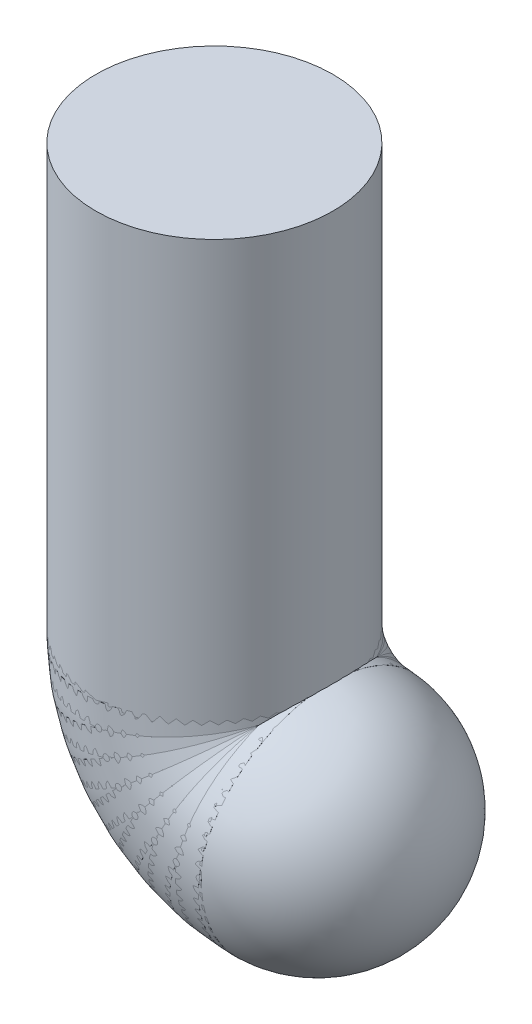
ISO-10303-21;
HEADER;
FILE_DESCRIPTION(('STEP AP214'),'2;1');
FILE_NAME('part.step','',(''),(''),'','','');
FILE_SCHEMA(('AUTOMOTIVE_DESIGN { 1 0 10303 214 1 1 1 1 }'));
ENDSEC;
DATA;
#1=APPLICATION_CONTEXT('core data for automotive mechanical design processes');
#2=APPLICATION_PROTOCOL_DEFINITION('international standard','automotive_design',2000,#1);
#3=PRODUCT_CONTEXT('',#1,'mechanical');
#4=PRODUCT('Part','Part','',(#3));
#5=PRODUCT_RELATED_PRODUCT_CATEGORY('part','',(#4));
#6=PRODUCT_DEFINITION_FORMATION('','',#4);
#7=PRODUCT_DEFINITION_CONTEXT('part definition',#1,'design');
#8=PRODUCT_DEFINITION('design','',#6,#7);
#9=PRODUCT_DEFINITION_SHAPE('','',#8);
#10=(LENGTH_UNIT() NAMED_UNIT(*) SI_UNIT(.MILLI.,.METRE.));
#11=(NAMED_UNIT(*) PLANE_ANGLE_UNIT() SI_UNIT($,.RADIAN.));
#12=(NAMED_UNIT(*) SI_UNIT($,.STERADIAN.) SOLID_ANGLE_UNIT());
#13=UNCERTAINTY_MEASURE_WITH_UNIT(LENGTH_MEASURE(1.E-05),#10,'distance_accuracy_value','');
#14=(GEOMETRIC_REPRESENTATION_CONTEXT(3) GLOBAL_UNCERTAINTY_ASSIGNED_CONTEXT((#13)) GLOBAL_UNIT_ASSIGNED_CONTEXT((#10,
#11,#12)) REPRESENTATION_CONTEXT('',''));
#15=CARTESIAN_POINT('',(0.,0.,0.));
#16=DIRECTION('',(0.,0.,1.));
#17=DIRECTION('',(1.,0.,0.));
#18=AXIS2_PLACEMENT_3D('',#15,#16,#17);
#19=CARTESIAN_POINT('',(-26.,-77.5,196.));
#20=DIRECTION('',(0.,-1.,0.));
#21=DIRECTION('',(0.,0.,-1.));
#22=AXIS2_PLACEMENT_3D('',#19,#20,#21);
#23=PLANE('',#22);
#24=CARTESIAN_POINT('',(-26.,-77.5,196.));
#25=DIRECTION('',(0.,-1.,0.));
#26=DIRECTION('',(0.,0.,-1.));
#27=AXIS2_PLACEMENT_3D('',#24,#25,#26);
#28=CIRCLE('',#27,4.5);
#29=CARTESIAN_POINT('',(-26.,-77.5,191.5));
#30=VERTEX_POINT('',#29);
#31=EDGE_CURVE('P0_E10',#30,#30,#28,.T.);
#32=ORIENTED_EDGE('',*,*,#31,.F.);
#33=EDGE_LOOP('',(#32));
#34=FACE_BOUND('',#33,.T.);
#35=ADVANCED_FACE('P0_F15',(#34),#23,.F.);
#36=CARTESIAN_POINT('',(-26.,-93.58,196.));
#37=DIRECTION('',(0.,-1.,0.));
#38=DIRECTION('',(0.,0.,-1.));
#39=AXIS2_PLACEMENT_3D('',#36,#37,#38);
#40=PLANE('',#39);
#41=CARTESIAN_POINT('',(-26.,-93.58,196.));
#42=DIRECTION('',(0.,-1.,0.));
#43=DIRECTION('',(0.,0.,-1.));
#44=AXIS2_PLACEMENT_3D('',#41,#42,#43);
#45=CIRCLE('',#44,4.5);
#46=CARTESIAN_POINT('',(-26.,-93.58,191.5));
#47=VERTEX_POINT('',#46);
#48=EDGE_CURVE('P0_E40',#47,#47,#45,.T.);
#49=ORIENTED_EDGE('',*,*,#48,.T.);
#50=EDGE_LOOP('',(#49));
#51=FACE_BOUND('',#50,.T.);
#52=ADVANCED_FACE('P0_F43',(#51),#40,.T.);
#53=CARTESIAN_POINT('',(-26.,-77.5,196.));
#54=DIRECTION('',(0.,-1.,0.));
#55=DIRECTION('',(0.,0.,-1.));
#56=AXIS2_PLACEMENT_3D('',#53,#54,#55);
#57=CYLINDRICAL_SURFACE('',#56,4.5);
#58=ORIENTED_EDGE('',*,*,#48,.F.);
#59=DIRECTION('',(0.,-1.,0.));
#60=VECTOR('',#59,1.);
#61=CARTESIAN_POINT('',(-26.,-77.5,191.5));
#62=LINE('',#61,#60);
#63=EDGE_CURVE('P0_E18',#30,#47,#62,.T.);
#64=ORIENTED_EDGE('',*,*,#63,.F.);
#65=ORIENTED_EDGE('',*,*,#31,.T.);
#66=ORIENTED_EDGE('',*,*,#63,.T.);
#67=EDGE_LOOP('',(#58,#64,#65,#66));
#68=FACE_BOUND('',#67,.T.);
#69=ADVANCED_FACE('P0_F39',(#68),#57,.T.);
#70=CLOSED_SHELL('',(#35,#52,#69));
#71=MANIFOLD_SOLID_BREP('P0_B1',#70);
#72=CARTESIAN_POINT('',(-26.,-93.58,196.));
#73=DIRECTION('',(0.111964476103031,-0.993712209893274,0.));
#74=DIRECTION('',(0.,0.,-1.));
#75=AXIS2_PLACEMENT_3D('',#72,#73,#74);
#76=PLANE('',#75);
#77=CARTESIAN_POINT('',(-26.,-93.58,196.));
#78=DIRECTION('',(0.111964476103031,-0.993712209893274,0.));
#79=DIRECTION('',(-0.993712209893274,-0.111964476103031,0.));
#80=AXIS2_PLACEMENT_3D('',#77,#78,#79);
#81=CIRCLE('',#80,4.5);
#82=CARTESIAN_POINT('',(-30.47170494452,-94.08384014246,196.));
#83=VERTEX_POINT('',#82);
#84=EDGE_CURVE('P1_E11',#83,#83,#81,.T.);
#85=ORIENTED_EDGE('',*,*,#84,.F.);
#86=EDGE_LOOP('',(#85));
#87=FACE_BOUND('',#86,.T.);
#88=ADVANCED_FACE('P1_F16',(#87),#76,.F.);
#89=CARTESIAN_POINT('',(-25.90171741575,-94.4522820611,196.));
#90=DIRECTION('',(0.111964476103031,-0.993712209893274,0.));
#91=DIRECTION('',(0.,0.,-1.));
#92=AXIS2_PLACEMENT_3D('',#89,#90,#91);
#93=PLANE('',#92);
#94=CARTESIAN_POINT('',(-25.90171741575,-94.4522820611,196.));
#95=DIRECTION('',(0.111964476103031,-0.993712209893274,0.));
#96=DIRECTION('',(-0.993712209893274,-0.111964476103031,0.));
#97=AXIS2_PLACEMENT_3D('',#94,#95,#96);
#98=CIRCLE('',#97,4.5);
#99=CARTESIAN_POINT('',(-30.37342236027,-94.95612220357,196.));
#100=VERTEX_POINT('',#99);
#101=EDGE_CURVE('P1_E20',#100,#100,#98,.T.);
#102=ORIENTED_EDGE('',*,*,#101,.T.);
#103=EDGE_LOOP('',(#102));
#104=FACE_BOUND('',#103,.T.);
#105=ADVANCED_FACE('P1_F18',(#104),#93,.T.);
#106=CARTESIAN_POINT('',(-26.,-93.58,196.));
#107=DIRECTION('',(0.111964476103031,-0.993712209893274,0.));
#108=DIRECTION('',(-0.993712209893274,-0.111964476103031,0.));
#109=AXIS2_PLACEMENT_3D('',#106,#107,#108);
#110=CYLINDRICAL_SURFACE('',#109,4.5);
#111=ORIENTED_EDGE('',*,*,#101,.F.);
#112=DIRECTION('',(0.111964476103031,-0.993712209893274,0.));
#113=VECTOR('',#112,1.);
#114=CARTESIAN_POINT('',(-30.47170494452,-94.08384014246,196.));
#115=LINE('',#114,#113);
#116=EDGE_CURVE('P1_E27',#83,#100,#115,.T.);
#117=ORIENTED_EDGE('',*,*,#116,.F.);
#118=ORIENTED_EDGE('',*,*,#84,.T.);
#119=ORIENTED_EDGE('',*,*,#116,.T.);
#120=EDGE_LOOP('',(#111,#117,#118,#119));
#121=FACE_BOUND('',#120,.T.);
#122=ADVANCED_FACE('P1_F41',(#121),#110,.T.);
#123=CLOSED_SHELL('',(#88,#105,#122));
#124=MANIFOLD_SOLID_BREP('P1_B1',#123);
#125=CARTESIAN_POINT('',(-25.90171741575,-94.4522820611,196.));
#126=DIRECTION('',(0.330279061955133,-0.943883330308379,0.));
#127=DIRECTION('',(0.,0.,-1.));
#128=AXIS2_PLACEMENT_3D('',#125,#126,#127);
#129=PLANE('',#128);
#130=CARTESIAN_POINT('',(-25.90171741575,-94.4522820611,196.));
#131=DIRECTION('',(0.330279061955133,-0.94388333030838,0.));
#132=DIRECTION('',(-0.94388333030838,-0.330279061955133,0.));
#133=AXIS2_PLACEMENT_3D('',#130,#131,#132);
#134=CIRCLE('',#133,4.5);
#135=CARTESIAN_POINT('',(-30.14919240214,-95.9385378399,196.));
#136=VERTEX_POINT('',#135);
#137=EDGE_CURVE('P2_E11',#136,#136,#134,.T.);
#138=ORIENTED_EDGE('',*,*,#137,.F.);
#139=EDGE_LOOP('',(#138));
#140=FACE_BOUND('',#139,.T.);
#141=ADVANCED_FACE('P2_F16',(#140),#129,.F.);
#142=CARTESIAN_POINT('',(-25.61179796217,-95.28082425734,196.));
#143=DIRECTION('',(0.330279061955133,-0.943883330308379,0.));
#144=DIRECTION('',(0.,0.,-1.));
#145=AXIS2_PLACEMENT_3D('',#142,#143,#144);
#146=PLANE('',#145);
#147=CARTESIAN_POINT('',(-25.61179796217,-95.28082425734,196.));
#148=DIRECTION('',(0.330279061955133,-0.94388333030838,0.));
#149=DIRECTION('',(-0.94388333030838,-0.330279061955133,0.));
#150=AXIS2_PLACEMENT_3D('',#147,#148,#149);
#151=CIRCLE('',#150,4.5);
#152=CARTESIAN_POINT('',(-29.85927294856,-96.76708003613,196.));
#153=VERTEX_POINT('',#152);
#154=EDGE_CURVE('P2_E20',#153,#153,#151,.T.);
#155=ORIENTED_EDGE('',*,*,#154,.T.);
#156=EDGE_LOOP('',(#155));
#157=FACE_BOUND('',#156,.T.);
#158=ADVANCED_FACE('P2_F44',(#157),#146,.T.);
#159=CARTESIAN_POINT('',(-25.90171741575,-94.4522820611,196.));
#160=DIRECTION('',(0.330279061955133,-0.94388333030838,0.));
#161=DIRECTION('',(-0.94388333030838,-0.330279061955133,0.));
#162=AXIS2_PLACEMENT_3D('',#159,#160,#161);
#163=CYLINDRICAL_SURFACE('',#162,4.5);
#164=ORIENTED_EDGE('',*,*,#154,.F.);
#165=DIRECTION('',(0.330279061955133,-0.943883330308379,0.));
#166=VECTOR('',#165,1.);
#167=CARTESIAN_POINT('',(-30.14919240214,-95.9385378399,196.));
#168=LINE('',#167,#166);
#169=EDGE_CURVE('P2_E27',#136,#153,#168,.T.);
#170=ORIENTED_EDGE('',*,*,#169,.F.);
#171=ORIENTED_EDGE('',*,*,#137,.T.);
#172=ORIENTED_EDGE('',*,*,#169,.T.);
#173=EDGE_LOOP('',(#164,#170,#171,#172));
#174=FACE_BOUND('',#173,.T.);
#175=ADVANCED_FACE('P2_F18',(#174),#163,.T.);
#176=CLOSED_SHELL('',(#141,#158,#175));
#177=MANIFOLD_SOLID_BREP('P2_B1',#176);
#178=CARTESIAN_POINT('',(-25.61179796217,-95.28082425734,196.));
#179=DIRECTION('',(0.532032076515223,-0.846724199228355,0.));
#180=DIRECTION('',(0.,0.,-1.));
#181=AXIS2_PLACEMENT_3D('',#178,#179,#180);
#182=PLANE('',#181);
#183=CARTESIAN_POINT('',(-25.61179796217,-95.28082425734,196.));
#184=DIRECTION('',(0.532032076515223,-0.846724199228355,0.));
#185=DIRECTION('',(-0.846724199228355,-0.532032076515223,0.));
#186=AXIS2_PLACEMENT_3D('',#183,#184,#185);
#187=CIRCLE('',#186,4.5);
#188=CARTESIAN_POINT('',(-29.4220568587,-97.67496860166,196.));
#189=VERTEX_POINT('',#188);
#190=EDGE_CURVE('P3_E11',#189,#189,#187,.T.);
#191=ORIENTED_EDGE('',*,*,#190,.F.);
#192=EDGE_LOOP('',(#191));
#193=FACE_BOUND('',#192,.T.);
#194=ADVANCED_FACE('P3_F16',(#193),#182,.F.);
#195=CARTESIAN_POINT('',(-25.14477941127,-96.02408002328,196.));
#196=DIRECTION('',(0.532032076515223,-0.846724199228355,0.));
#197=DIRECTION('',(0.,0.,-1.));
#198=AXIS2_PLACEMENT_3D('',#195,#196,#197);
#199=PLANE('',#198);
#200=CARTESIAN_POINT('',(-25.14477941127,-96.02408002328,196.));
#201=DIRECTION('',(0.532032076515223,-0.846724199228355,0.));
#202=DIRECTION('',(-0.846724199228355,-0.532032076515223,0.));
#203=AXIS2_PLACEMENT_3D('',#200,#201,#202);
#204=CIRCLE('',#203,4.5);
#205=CARTESIAN_POINT('',(-28.9550383078,-98.4182243676,196.));
#206=VERTEX_POINT('',#205);
#207=EDGE_CURVE('P3_E40',#206,#206,#204,.T.);
#208=ORIENTED_EDGE('',*,*,#207,.T.);
#209=EDGE_LOOP('',(#208));
#210=FACE_BOUND('',#209,.T.);
#211=ADVANCED_FACE('P3_F43',(#210),#199,.T.);
#212=CARTESIAN_POINT('',(-25.61179796217,-95.28082425734,196.));
#213=DIRECTION('',(0.532032076515223,-0.846724199228355,0.));
#214=DIRECTION('',(-0.846724199228355,-0.532032076515223,0.));
#215=AXIS2_PLACEMENT_3D('',#212,#213,#214);
#216=CYLINDRICAL_SURFACE('',#215,4.5);
#217=ORIENTED_EDGE('',*,*,#207,.F.);
#218=DIRECTION('',(0.532032076515223,-0.846724199228355,0.));
#219=VECTOR('',#218,1.);
#220=CARTESIAN_POINT('',(-29.4220568587,-97.67496860166,196.));
#221=LINE('',#220,#219);
#222=EDGE_CURVE('P3_E20',#189,#206,#221,.T.);
#223=ORIENTED_EDGE('',*,*,#222,.F.);
#224=ORIENTED_EDGE('',*,*,#190,.T.);
#225=ORIENTED_EDGE('',*,*,#222,.T.);
#226=EDGE_LOOP('',(#217,#223,#224,#225));
#227=FACE_BOUND('',#226,.T.);
#228=ADVANCED_FACE('P3_F18',(#227),#216,.T.);
#229=CLOSED_SHELL('',(#194,#211,#228));
#230=MANIFOLD_SOLID_BREP('P3_B1',#229);
#231=CARTESIAN_POINT('',(-25.14477941127,-96.02408002328,196.));
#232=DIRECTION('',(0.707106781186548,-0.707106781186548,0.));
#233=DIRECTION('',(0.,0.,-1.));
#234=AXIS2_PLACEMENT_3D('',#231,#232,#233);
#235=PLANE('',#234);
#236=CARTESIAN_POINT('',(-25.14477941127,-96.02408002328,196.));
#237=DIRECTION('',(0.707106781186548,-0.707106781186548,0.));
#238=DIRECTION('',(0.707106781186548,0.707106781186548,0.));
#239=AXIS2_PLACEMENT_3D('',#236,#237,#238);
#240=CIRCLE('',#239,4.5);
#241=CARTESIAN_POINT('',(-21.96279889593,-92.84209950794,196.));
#242=VERTEX_POINT('',#241);
#243=EDGE_CURVE('P4_E11',#242,#242,#240,.T.);
#244=ORIENTED_EDGE('',*,*,#243,.F.);
#245=EDGE_LOOP('',(#244));
#246=FACE_BOUND('',#245,.T.);
#247=ADVANCED_FACE('P4_F16',(#246),#235,.F.);
#248=CARTESIAN_POINT('',(-24.52408002328,-96.64477941127,196.));
#249=DIRECTION('',(0.707106781186548,-0.707106781186548,0.));
#250=DIRECTION('',(0.,0.,-1.));
#251=AXIS2_PLACEMENT_3D('',#248,#249,#250);
#252=PLANE('',#251);
#253=CARTESIAN_POINT('',(-24.52408002328,-96.64477941127,196.));
#254=DIRECTION('',(0.707106781186548,-0.707106781186548,0.));
#255=DIRECTION('',(0.707106781186548,0.707106781186548,0.));
#256=AXIS2_PLACEMENT_3D('',#253,#254,#255);
#257=CIRCLE('',#256,4.5);
#258=CARTESIAN_POINT('',(-21.34209950794,-93.46279889593,196.));
#259=VERTEX_POINT('',#258);
#260=EDGE_CURVE('P4_E20',#259,#259,#257,.T.);
#261=ORIENTED_EDGE('',*,*,#260,.T.);
#262=EDGE_LOOP('',(#261));
#263=FACE_BOUND('',#262,.T.);
#264=ADVANCED_FACE('P4_F44',(#263),#252,.T.);
#265=CARTESIAN_POINT('',(-25.14477941127,-96.02408002328,196.));
#266=DIRECTION('',(0.707106781186548,-0.707106781186548,0.));
#267=DIRECTION('',(0.707106781186548,0.707106781186548,0.));
#268=AXIS2_PLACEMENT_3D('',#265,#266,#267);
#269=CYLINDRICAL_SURFACE('',#268,4.5);
#270=ORIENTED_EDGE('',*,*,#260,.F.);
#271=DIRECTION('',(0.707106781186548,-0.707106781186548,0.));
#272=VECTOR('',#271,1.);
#273=CARTESIAN_POINT('',(-21.96279889593,-92.84209950794,196.));
#274=LINE('',#273,#272);
#275=EDGE_CURVE('P4_E27',#242,#259,#274,.T.);
#276=ORIENTED_EDGE('',*,*,#275,.F.);
#277=ORIENTED_EDGE('',*,*,#243,.T.);
#278=ORIENTED_EDGE('',*,*,#275,.T.);
#279=EDGE_LOOP('',(#270,#276,#277,#278));
#280=FACE_BOUND('',#279,.T.);
#281=ADVANCED_FACE('P4_F18',(#280),#269,.T.);
#282=CLOSED_SHELL('',(#247,#264,#281));
#283=MANIFOLD_SOLID_BREP('P4_B1',#282);
#284=CARTESIAN_POINT('',(-24.52408002328,-96.64477941127,196.));
#285=DIRECTION('',(0.846724199228355,-0.532032076515223,0.));
#286=DIRECTION('',(0.,0.,-1.));
#287=AXIS2_PLACEMENT_3D('',#284,#285,#286);
#288=PLANE('',#287);
#289=CARTESIAN_POINT('',(-24.52408002328,-96.64477941127,196.));
#290=DIRECTION('',(0.846724199228355,-0.532032076515223,0.));
#291=DIRECTION('',(0.532032076515223,0.846724199228355,0.));
#292=AXIS2_PLACEMENT_3D('',#289,#290,#291);
#293=CIRCLE('',#292,4.5);
#294=CARTESIAN_POINT('',(-22.12993567896,-92.83452051474,196.));
#295=VERTEX_POINT('',#294);
#296=EDGE_CURVE('P5_E11',#295,#295,#293,.T.);
#297=ORIENTED_EDGE('',*,*,#296,.F.);
#298=EDGE_LOOP('',(#297));
#299=FACE_BOUND('',#298,.T.);
#300=ADVANCED_FACE('P5_F16',(#299),#288,.F.);
#301=CARTESIAN_POINT('',(-23.78082425734,-97.11179796217,196.));
#302=DIRECTION('',(0.846724199228355,-0.532032076515223,0.));
#303=DIRECTION('',(0.,0.,-1.));
#304=AXIS2_PLACEMENT_3D('',#301,#302,#303);
#305=PLANE('',#304);
#306=CARTESIAN_POINT('',(-23.78082425734,-97.11179796217,196.));
#307=DIRECTION('',(0.846724199228355,-0.532032076515223,0.));
#308=DIRECTION('',(0.532032076515223,0.846724199228355,0.));
#309=AXIS2_PLACEMENT_3D('',#306,#307,#308);
#310=CIRCLE('',#309,4.5);
#311=CARTESIAN_POINT('',(-21.38667991302,-93.30153906565,196.));
#312=VERTEX_POINT('',#311);
#313=EDGE_CURVE('P5_E20',#312,#312,#310,.T.);
#314=ORIENTED_EDGE('',*,*,#313,.T.);
#315=EDGE_LOOP('',(#314));
#316=FACE_BOUND('',#315,.T.);
#317=ADVANCED_FACE('P5_F18',(#316),#305,.T.);
#318=CARTESIAN_POINT('',(-24.52408002328,-96.64477941127,196.));
#319=DIRECTION('',(0.846724199228355,-0.532032076515223,0.));
#320=DIRECTION('',(0.532032076515223,0.846724199228355,0.));
#321=AXIS2_PLACEMENT_3D('',#318,#319,#320);
#322=CYLINDRICAL_SURFACE('',#321,4.5);
#323=ORIENTED_EDGE('',*,*,#313,.F.);
#324=DIRECTION('',(0.846724199228355,-0.532032076515223,0.));
#325=VECTOR('',#324,1.);
#326=CARTESIAN_POINT('',(-22.12993567896,-92.83452051474,196.));
#327=LINE('',#326,#325);
#328=EDGE_CURVE('P5_E27',#295,#312,#327,.T.);
#329=ORIENTED_EDGE('',*,*,#328,.F.);
#330=ORIENTED_EDGE('',*,*,#296,.T.);
#331=ORIENTED_EDGE('',*,*,#328,.T.);
#332=EDGE_LOOP('',(#323,#329,#330,#331));
#333=FACE_BOUND('',#332,.T.);
#334=ADVANCED_FACE('P5_F42',(#333),#322,.T.);
#335=CLOSED_SHELL('',(#300,#317,#334));
#336=MANIFOLD_SOLID_BREP('P5_B1',#335);
#337=CARTESIAN_POINT('',(-23.78082425734,-97.11179796217,196.));
#338=DIRECTION('',(0.943883330308379,-0.330279061955133,0.));
#339=DIRECTION('',(0.,0.,-1.));
#340=AXIS2_PLACEMENT_3D('',#337,#338,#339);
#341=PLANE('',#340);
#342=CARTESIAN_POINT('',(-23.78082425734,-97.11179796217,196.));
#343=DIRECTION('',(0.94388333030838,-0.330279061955133,0.));
#344=DIRECTION('',(0.330279061955133,0.94388333030838,0.));
#345=AXIS2_PLACEMENT_3D('',#342,#343,#344);
#346=CIRCLE('',#345,4.5);
#347=CARTESIAN_POINT('',(-22.29456847854,-92.86432297579,196.));
#348=VERTEX_POINT('',#347);
#349=EDGE_CURVE('P6_E11',#348,#348,#346,.T.);
#350=ORIENTED_EDGE('',*,*,#349,.F.);
#351=EDGE_LOOP('',(#350));
#352=FACE_BOUND('',#351,.T.);
#353=ADVANCED_FACE('P6_F16',(#352),#341,.F.);
#354=CARTESIAN_POINT('',(-22.9522820611,-97.40171741575,196.));
#355=DIRECTION('',(0.943883330308379,-0.330279061955133,0.));
#356=DIRECTION('',(0.,0.,-1.));
#357=AXIS2_PLACEMENT_3D('',#354,#355,#356);
#358=PLANE('',#357);
#359=CARTESIAN_POINT('',(-22.9522820611,-97.40171741575,196.));
#360=DIRECTION('',(0.94388333030838,-0.330279061955133,0.));
#361=DIRECTION('',(0.330279061955133,0.94388333030838,0.));
#362=AXIS2_PLACEMENT_3D('',#359,#360,#361);
#363=CIRCLE('',#362,4.5);
#364=CARTESIAN_POINT('',(-21.46602628231,-93.15424242936,196.));
#365=VERTEX_POINT('',#364);
#366=EDGE_CURVE('P6_E40',#365,#365,#363,.T.);
#367=ORIENTED_EDGE('',*,*,#366,.T.);
#368=EDGE_LOOP('',(#367));
#369=FACE_BOUND('',#368,.T.);
#370=ADVANCED_FACE('P6_F43',(#369),#358,.T.);
#371=CARTESIAN_POINT('',(-23.78082425734,-97.11179796217,196.));
#372=DIRECTION('',(0.94388333030838,-0.330279061955133,0.));
#373=DIRECTION('',(0.330279061955133,0.94388333030838,0.));
#374=AXIS2_PLACEMENT_3D('',#371,#372,#373);
#375=CYLINDRICAL_SURFACE('',#374,4.5);
#376=ORIENTED_EDGE('',*,*,#366,.F.);
#377=DIRECTION('',(0.943883330308379,-0.330279061955133,0.));
#378=VECTOR('',#377,1.);
#379=CARTESIAN_POINT('',(-22.29456847854,-92.86432297579,196.));
#380=LINE('',#379,#378);
#381=EDGE_CURVE('P6_E25',#348,#365,#380,.T.);
#382=ORIENTED_EDGE('',*,*,#381,.F.);
#383=ORIENTED_EDGE('',*,*,#349,.T.);
#384=ORIENTED_EDGE('',*,*,#381,.T.);
#385=EDGE_LOOP('',(#376,#382,#383,#384));
#386=FACE_BOUND('',#385,.T.);
#387=ADVANCED_FACE('P6_F18',(#386),#375,.T.);
#388=CLOSED_SHELL('',(#353,#370,#387));
#389=MANIFOLD_SOLID_BREP('P6_B1',#388);
#390=CARTESIAN_POINT('',(-22.9522820611,-97.40171741575,196.));
#391=DIRECTION('',(0.993712209893274,-0.111964476103031,0.));
#392=DIRECTION('',(0.,0.,-1.));
#393=AXIS2_PLACEMENT_3D('',#390,#391,#392);
#394=PLANE('',#393);
#395=CARTESIAN_POINT('',(-22.9522820611,-97.40171741575,196.));
#396=DIRECTION('',(0.993712209893274,-0.111964476103031,0.));
#397=DIRECTION('',(0.111964476103031,0.993712209893274,0.));
#398=AXIS2_PLACEMENT_3D('',#395,#396,#397);
#399=CIRCLE('',#398,4.5);
#400=CARTESIAN_POINT('',(-22.44844191864,-92.93001247123,196.));
#401=VERTEX_POINT('',#400);
#402=EDGE_CURVE('P7_E11',#401,#401,#399,.T.);
#403=ORIENTED_EDGE('',*,*,#402,.F.);
#404=EDGE_LOOP('',(#403));
#405=FACE_BOUND('',#404,.T.);
#406=ADVANCED_FACE('P7_F16',(#405),#394,.F.);
#407=CARTESIAN_POINT('',(-22.08,-97.5,196.));
#408=DIRECTION('',(0.993712209893274,-0.111964476103031,0.));
#409=DIRECTION('',(0.,0.,-1.));
#410=AXIS2_PLACEMENT_3D('',#407,#408,#409);
#411=PLANE('',#410);
#412=CARTESIAN_POINT('',(-22.08,-97.5,196.));
#413=DIRECTION('',(0.993712209893274,-0.111964476103031,0.));
#414=DIRECTION('',(0.111964476103031,0.993712209893274,0.));
#415=AXIS2_PLACEMENT_3D('',#412,#413,#414);
#416=CIRCLE('',#415,4.5);
#417=CARTESIAN_POINT('',(-21.57615985753,-93.02829505548,196.));
#418=VERTEX_POINT('',#417);
#419=EDGE_CURVE('P7_E40',#418,#418,#416,.T.);
#420=ORIENTED_EDGE('',*,*,#419,.T.);
#421=EDGE_LOOP('',(#420));
#422=FACE_BOUND('',#421,.T.);
#423=ADVANCED_FACE('P7_F44',(#422),#411,.T.);
#424=CARTESIAN_POINT('',(-22.9522820611,-97.40171741575,196.));
#425=DIRECTION('',(0.993712209893274,-0.111964476103031,0.));
#426=DIRECTION('',(0.111964476103031,0.993712209893274,0.));
#427=AXIS2_PLACEMENT_3D('',#424,#425,#426);
#428=CYLINDRICAL_SURFACE('',#427,4.5);
#429=ORIENTED_EDGE('',*,*,#419,.F.);
#430=DIRECTION('',(0.993712209893274,-0.111964476103031,0.));
#431=VECTOR('',#430,1.);
#432=CARTESIAN_POINT('',(-22.44844191864,-92.93001247123,196.));
#433=LINE('',#432,#431);
#434=EDGE_CURVE('P7_E25',#401,#418,#433,.T.);
#435=ORIENTED_EDGE('',*,*,#434,.F.);
#436=ORIENTED_EDGE('',*,*,#402,.T.);
#437=ORIENTED_EDGE('',*,*,#434,.T.);
#438=EDGE_LOOP('',(#429,#435,#436,#437));
#439=FACE_BOUND('',#438,.T.);
#440=ADVANCED_FACE('P7_F39',(#439),#428,.T.);
#441=CLOSED_SHELL('',(#406,#423,#440));
#442=MANIFOLD_SOLID_BREP('P7_B1',#441);
#443=CARTESIAN_POINT('',(-22.08,-97.5,196.));
#444=DIRECTION('',(1.,0.,0.));
#445=DIRECTION('',(0.,1.,0.));
#446=AXIS2_PLACEMENT_3D('',#443,#444,#445);
#447=PLANE('',#446);
#448=CARTESIAN_POINT('',(-22.08,-97.5,196.));
#449=DIRECTION('',(1.,0.,0.));
#450=DIRECTION('',(0.,0.,1.));
#451=AXIS2_PLACEMENT_3D('',#448,#449,#450);
#452=CIRCLE('',#451,4.5);
#453=CARTESIAN_POINT('',(-22.08,-97.5,200.5));
#454=VERTEX_POINT('',#453);
#455=EDGE_CURVE('P8_E11',#454,#454,#452,.T.);
#456=ORIENTED_EDGE('',*,*,#455,.F.);
#457=EDGE_LOOP('',(#456));
#458=FACE_BOUND('',#457,.T.);
#459=ADVANCED_FACE('P8_F16',(#458),#447,.F.);
#460=CARTESIAN_POINT('',(-22.,-97.5,196.));
#461=DIRECTION('',(1.,0.,0.));
#462=DIRECTION('',(0.,1.,0.));
#463=AXIS2_PLACEMENT_3D('',#460,#461,#462);
#464=PLANE('',#463);
#465=CARTESIAN_POINT('',(-22.,-97.5,196.));
#466=DIRECTION('',(1.,0.,0.));
#467=DIRECTION('',(0.,0.,1.));
#468=AXIS2_PLACEMENT_3D('',#465,#466,#467);
#469=CIRCLE('',#468,4.5);
#470=CARTESIAN_POINT('',(-22.,-97.5,200.5));
#471=VERTEX_POINT('',#470);
#472=EDGE_CURVE('P8_E40',#471,#471,#469,.T.);
#473=ORIENTED_EDGE('',*,*,#472,.T.);
#474=EDGE_LOOP('',(#473));
#475=FACE_BOUND('',#474,.T.);
#476=ADVANCED_FACE('P8_F44',(#475),#464,.T.);
#477=CARTESIAN_POINT('',(-22.08,-97.5,196.));
#478=DIRECTION('',(1.,0.,0.));
#479=DIRECTION('',(0.,0.,1.));
#480=AXIS2_PLACEMENT_3D('',#477,#478,#479);
#481=CYLINDRICAL_SURFACE('',#480,4.5);
#482=ORIENTED_EDGE('',*,*,#472,.F.);
#483=DIRECTION('',(1.,0.,0.));
#484=VECTOR('',#483,1.);
#485=CARTESIAN_POINT('',(-22.08,-97.5,200.5));
#486=LINE('',#485,#484);
#487=EDGE_CURVE('P8_E26',#454,#471,#486,.T.);
#488=ORIENTED_EDGE('',*,*,#487,.F.);
#489=ORIENTED_EDGE('',*,*,#455,.T.);
#490=ORIENTED_EDGE('',*,*,#487,.T.);
#491=EDGE_LOOP('',(#482,#488,#489,#490));
#492=FACE_BOUND('',#491,.T.);
#493=ADVANCED_FACE('P8_F18',(#492),#481,.T.);
#494=CLOSED_SHELL('',(#459,#476,#493));
#495=MANIFOLD_SOLID_BREP('P8_B1',#494);
#496=CARTESIAN_POINT('',(-26.,-93.58,196.));
#497=DIRECTION('',(0.,0.,1.));
#498=DIRECTION('',(1.,0.,0.));
#499=AXIS2_PLACEMENT_3D('',#496,#497,#498);
#500=SPHERICAL_SURFACE('',#499,4.5);
#501=CARTESIAN_POINT('',(-26.,-93.58,191.5));
#502=VERTEX_POINT('',#501);
#503=VERTEX_LOOP('',#502);
#504=FACE_BOUND('',#503,.T.);
#505=ADVANCED_FACE('P9_F14',(#504),#500,.T.);
#506=CLOSED_SHELL('',(#505));
#507=MANIFOLD_SOLID_BREP('P9_B1',#506);
#508=CARTESIAN_POINT('',(-25.90171741575,-94.4522820611,196.));
#509=DIRECTION('',(0.,0.,1.));
#510=DIRECTION('',(1.,0.,0.));
#511=AXIS2_PLACEMENT_3D('',#508,#509,#510);
#512=SPHERICAL_SURFACE('',#511,4.5);
#513=CARTESIAN_POINT('',(-25.90171741575,-94.4522820611,191.5));
#514=VERTEX_POINT('',#513);
#515=VERTEX_LOOP('',#514);
#516=FACE_BOUND('',#515,.T.);
#517=ADVANCED_FACE('P10_F14',(#516),#512,.T.);
#518=CLOSED_SHELL('',(#517));
#519=MANIFOLD_SOLID_BREP('P10_B1',#518);
#520=CARTESIAN_POINT('',(-25.61179796217,-95.28082425734,196.));
#521=DIRECTION('',(0.,0.,1.));
#522=DIRECTION('',(1.,0.,0.));
#523=AXIS2_PLACEMENT_3D('',#520,#521,#522);
#524=SPHERICAL_SURFACE('',#523,4.5);
#525=CARTESIAN_POINT('',(-25.61179796217,-95.28082425734,191.5));
#526=VERTEX_POINT('',#525);
#527=VERTEX_LOOP('',#526);
#528=FACE_BOUND('',#527,.T.);
#529=ADVANCED_FACE('P11_F14',(#528),#524,.T.);
#530=CLOSED_SHELL('',(#529));
#531=MANIFOLD_SOLID_BREP('P11_B1',#530);
#532=CARTESIAN_POINT('',(-25.14477941127,-96.02408002328,196.));
#533=DIRECTION('',(0.,0.,1.));
#534=DIRECTION('',(1.,0.,0.));
#535=AXIS2_PLACEMENT_3D('',#532,#533,#534);
#536=SPHERICAL_SURFACE('',#535,4.5);
#537=CARTESIAN_POINT('',(-25.14477941127,-96.02408002328,191.5));
#538=VERTEX_POINT('',#537);
#539=VERTEX_LOOP('',#538);
#540=FACE_BOUND('',#539,.T.);
#541=ADVANCED_FACE('P12_F14',(#540),#536,.T.);
#542=CLOSED_SHELL('',(#541));
#543=MANIFOLD_SOLID_BREP('P12_B1',#542);
#544=CARTESIAN_POINT('',(-24.52408002328,-96.64477941127,196.));
#545=DIRECTION('',(0.,0.,1.));
#546=DIRECTION('',(1.,0.,0.));
#547=AXIS2_PLACEMENT_3D('',#544,#545,#546);
#548=SPHERICAL_SURFACE('',#547,4.5);
#549=CARTESIAN_POINT('',(-24.52408002328,-96.64477941127,191.5));
#550=VERTEX_POINT('',#549);
#551=VERTEX_LOOP('',#550);
#552=FACE_BOUND('',#551,.T.);
#553=ADVANCED_FACE('P13_F14',(#552),#548,.T.);
#554=CLOSED_SHELL('',(#553));
#555=MANIFOLD_SOLID_BREP('P13_B1',#554);
#556=CARTESIAN_POINT('',(-23.78082425734,-97.11179796217,196.));
#557=DIRECTION('',(0.,0.,1.));
#558=DIRECTION('',(1.,0.,0.));
#559=AXIS2_PLACEMENT_3D('',#556,#557,#558);
#560=SPHERICAL_SURFACE('',#559,4.5);
#561=CARTESIAN_POINT('',(-23.78082425734,-97.11179796217,191.5));
#562=VERTEX_POINT('',#561);
#563=VERTEX_LOOP('',#562);
#564=FACE_BOUND('',#563,.T.);
#565=ADVANCED_FACE('P14_F14',(#564),#560,.T.);
#566=CLOSED_SHELL('',(#565));
#567=MANIFOLD_SOLID_BREP('P14_B1',#566);
#568=CARTESIAN_POINT('',(-22.9522820611,-97.40171741575,196.));
#569=DIRECTION('',(0.,0.,1.));
#570=DIRECTION('',(1.,0.,0.));
#571=AXIS2_PLACEMENT_3D('',#568,#569,#570);
#572=SPHERICAL_SURFACE('',#571,4.5);
#573=CARTESIAN_POINT('',(-22.9522820611,-97.40171741575,191.5));
#574=VERTEX_POINT('',#573);
#575=VERTEX_LOOP('',#574);
#576=FACE_BOUND('',#575,.T.);
#577=ADVANCED_FACE('P15_F14',(#576),#572,.T.);
#578=CLOSED_SHELL('',(#577));
#579=MANIFOLD_SOLID_BREP('P15_B1',#578);
#580=CARTESIAN_POINT('',(-22.08,-97.5,196.));
#581=DIRECTION('',(0.,0.,1.));
#582=DIRECTION('',(1.,0.,0.));
#583=AXIS2_PLACEMENT_3D('',#580,#581,#582);
#584=SPHERICAL_SURFACE('',#583,4.5);
#585=CARTESIAN_POINT('',(-22.08,-97.5,191.5));
#586=VERTEX_POINT('',#585);
#587=VERTEX_LOOP('',#586);
#588=FACE_BOUND('',#587,.T.);
#589=ADVANCED_FACE('P16_F13',(#588),#584,.T.);
#590=CLOSED_SHELL('',(#589));
#591=MANIFOLD_SOLID_BREP('P16_B1',#590);
#592=ADVANCED_BREP_SHAPE_REPRESENTATION('',(#18,#71,#124,#177,#230,#283,#336,#389,#442,#495,
#507,#519,#531,#543,#555,#567,#579,#591),#14);
#593=SHAPE_DEFINITION_REPRESENTATION(#9,#592);
ENDSEC;
END-ISO-10303-21;
